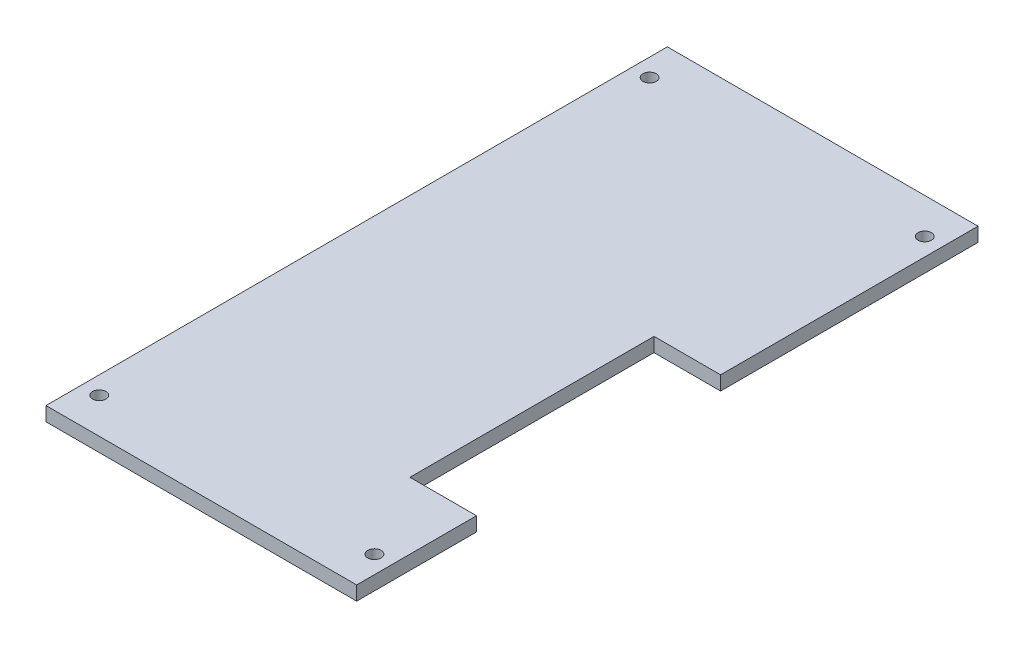
ISO-10303-21;
HEADER;
FILE_DESCRIPTION(('STEP AP214'),'2;1');
FILE_NAME('part.step','',(''),(''),'','','');
FILE_SCHEMA(('AUTOMOTIVE_DESIGN { 1 0 10303 214 1 1 1 1 }'));
ENDSEC;
DATA;
#1=APPLICATION_CONTEXT('core data for automotive mechanical design processes');
#2=APPLICATION_PROTOCOL_DEFINITION('international standard','automotive_design',2000,#1);
#3=PRODUCT_CONTEXT('',#1,'mechanical');
#4=PRODUCT('Part','Part','',(#3));
#5=PRODUCT_RELATED_PRODUCT_CATEGORY('part','',(#4));
#6=PRODUCT_DEFINITION_FORMATION('','',#4);
#7=PRODUCT_DEFINITION_CONTEXT('part definition',#1,'design');
#8=PRODUCT_DEFINITION('design','',#6,#7);
#9=PRODUCT_DEFINITION_SHAPE('','',#8);
#10=(LENGTH_UNIT() NAMED_UNIT(*) SI_UNIT(.MILLI.,.METRE.));
#11=(NAMED_UNIT(*) PLANE_ANGLE_UNIT() SI_UNIT($,.RADIAN.));
#12=(NAMED_UNIT(*) SI_UNIT($,.STERADIAN.) SOLID_ANGLE_UNIT());
#13=UNCERTAINTY_MEASURE_WITH_UNIT(LENGTH_MEASURE(1.E-05),#10,'distance_accuracy_value','');
#14=(GEOMETRIC_REPRESENTATION_CONTEXT(3) GLOBAL_UNCERTAINTY_ASSIGNED_CONTEXT((#13)) GLOBAL_UNIT_ASSIGNED_CONTEXT((#10,
#11,#12)) REPRESENTATION_CONTEXT('',''));
#15=CARTESIAN_POINT('',(0.,0.,0.));
#16=DIRECTION('',(0.,0.,1.));
#17=DIRECTION('',(1.,0.,0.));
#18=AXIS2_PLACEMENT_3D('',#15,#16,#17);
#19=CARTESIAN_POINT('',(0.,3.175,0.));
#20=DIRECTION('',(0.,1.,0.));
#21=DIRECTION('',(0.,0.,1.));
#22=AXIS2_PLACEMENT_3D('',#19,#20,#21);
#23=PLANE('',#22);
#24=CARTESIAN_POINT('',(-31.,3.175,-62.));
#25=DIRECTION('',(0.,1.,0.));
#26=DIRECTION('',(0.,0.,1.));
#27=AXIS2_PLACEMENT_3D('',#24,#25,#26);
#28=CIRCLE('',#27,1.5);
#29=CARTESIAN_POINT('',(-31.,3.175,-60.5));
#30=VERTEX_POINT('',#29);
#31=EDGE_CURVE('E190',#30,#30,#28,.T.);
#32=ORIENTED_EDGE('',*,*,#31,.F.);
#33=EDGE_LOOP('',(#32));
#34=FACE_BOUND('',#33,.T.);
#35=CARTESIAN_POINT('',(31.,3.175,62.));
#36=DIRECTION('',(0.,1.,0.));
#37=DIRECTION('',(0.,0.,1.));
#38=AXIS2_PLACEMENT_3D('',#35,#36,#37);
#39=CIRCLE('',#38,1.50000000000001);
#40=CARTESIAN_POINT('',(31.,3.175,63.5));
#41=VERTEX_POINT('',#40);
#42=EDGE_CURVE('E136',#41,#41,#39,.T.);
#43=ORIENTED_EDGE('',*,*,#42,.F.);
#44=EDGE_LOOP('',(#43));
#45=FACE_BOUND('',#44,.T.);
#46=DIRECTION('',(0.,0.,1.));
#47=VECTOR('',#46,1.);
#48=CARTESIAN_POINT('',(-35.,3.175,70.));
#49=LINE('',#48,#47);
#50=CARTESIAN_POINT('',(-35.,3.175,-70.));
#51=VERTEX_POINT('',#50);
#52=CARTESIAN_POINT('',(-35.,3.175,70.));
#53=VERTEX_POINT('',#52);
#54=EDGE_CURVE('E147',#51,#53,#49,.T.);
#55=ORIENTED_EDGE('',*,*,#54,.T.);
#56=DIRECTION('',(1.,0.,0.));
#57=VECTOR('',#56,1.);
#58=CARTESIAN_POINT('',(35.,3.175,70.));
#59=LINE('',#58,#57);
#60=CARTESIAN_POINT('',(35.,3.175,70.));
#61=VERTEX_POINT('',#60);
#62=EDGE_CURVE('E95',#53,#61,#59,.T.);
#63=ORIENTED_EDGE('',*,*,#62,.T.);
#64=DIRECTION('',(0.,0.,-1.));
#65=VECTOR('',#64,1.);
#66=CARTESIAN_POINT('',(35.,3.175,70.));
#67=LINE('',#66,#65);
#68=CARTESIAN_POINT('',(35.,3.175,43.));
#69=VERTEX_POINT('',#68);
#70=EDGE_CURVE('E162',#61,#69,#67,.T.);
#71=ORIENTED_EDGE('',*,*,#70,.T.);
#72=DIRECTION('',(-1.,0.,0.));
#73=VECTOR('',#72,1.);
#74=CARTESIAN_POINT('',(20.,3.175,43.));
#75=LINE('',#74,#73);
#76=CARTESIAN_POINT('',(20.,3.175,43.));
#77=VERTEX_POINT('',#76);
#78=EDGE_CURVE('E175',#69,#77,#75,.T.);
#79=ORIENTED_EDGE('',*,*,#78,.T.);
#80=DIRECTION('',(0.,0.,-1.));
#81=VECTOR('',#80,1.);
#82=CARTESIAN_POINT('',(20.,3.175,-11.999999982));
#83=LINE('',#82,#81);
#84=CARTESIAN_POINT('',(20.,3.175,-11.999999982));
#85=VERTEX_POINT('',#84);
#86=EDGE_CURVE('E114',#77,#85,#83,.T.);
#87=ORIENTED_EDGE('',*,*,#86,.T.);
#88=DIRECTION('',(1.,0.,0.));
#89=VECTOR('',#88,1.);
#90=CARTESIAN_POINT('',(35.,3.175,-11.999999982));
#91=LINE('',#90,#89);
#92=CARTESIAN_POINT('',(35.,3.175,-11.999999982));
#93=VERTEX_POINT('',#92);
#94=EDGE_CURVE('E108',#85,#93,#91,.T.);
#95=ORIENTED_EDGE('',*,*,#94,.T.);
#96=DIRECTION('',(0.,0.,-1.));
#97=VECTOR('',#96,1.);
#98=CARTESIAN_POINT('',(35.,3.175,-11.999999982));
#99=LINE('',#98,#97);
#100=CARTESIAN_POINT('',(35.,3.175,-70.));
#101=VERTEX_POINT('',#100);
#102=EDGE_CURVE('E112',#93,#101,#99,.T.);
#103=ORIENTED_EDGE('',*,*,#102,.T.);
#104=DIRECTION('',(-1.,0.,0.));
#105=VECTOR('',#104,1.);
#106=CARTESIAN_POINT('',(35.,3.175,-70.));
#107=LINE('',#106,#105);
#108=EDGE_CURVE('E52',#101,#51,#107,.T.);
#109=ORIENTED_EDGE('',*,*,#108,.T.);
#110=EDGE_LOOP('',(#55,#63,#71,#79,#87,#95,#103,#109));
#111=FACE_BOUND('',#110,.T.);
#112=CARTESIAN_POINT('',(-31.,3.175,62.));
#113=DIRECTION('',(0.,1.,0.));
#114=DIRECTION('',(0.,0.,-1.));
#115=AXIS2_PLACEMENT_3D('',#112,#113,#114);
#116=CIRCLE('',#115,1.50000000000001);
#117=CARTESIAN_POINT('',(-31.,3.175,60.5));
#118=VERTEX_POINT('',#117);
#119=EDGE_CURVE('E184',#118,#118,#116,.T.);
#120=ORIENTED_EDGE('',*,*,#119,.F.);
#121=EDGE_LOOP('',(#120));
#122=FACE_BOUND('',#121,.T.);
#123=CARTESIAN_POINT('',(31.,3.175,-62.));
#124=DIRECTION('',(0.,1.,0.));
#125=DIRECTION('',(0.,0.,-1.));
#126=AXIS2_PLACEMENT_3D('',#123,#124,#125);
#127=CIRCLE('',#126,1.50000000000001);
#128=CARTESIAN_POINT('',(31.,3.175,-63.5));
#129=VERTEX_POINT('',#128);
#130=EDGE_CURVE('E196',#129,#129,#127,.T.);
#131=ORIENTED_EDGE('',*,*,#130,.F.);
#132=EDGE_LOOP('',(#131));
#133=FACE_BOUND('',#132,.T.);
#134=ADVANCED_FACE('F35',(#34,#45,#111,#122,#133),#23,.T.);
#135=CARTESIAN_POINT('',(0.,0.,0.));
#136=DIRECTION('',(0.,1.,0.));
#137=DIRECTION('',(0.,0.,1.));
#138=AXIS2_PLACEMENT_3D('',#135,#136,#137);
#139=PLANE('',#138);
#140=CARTESIAN_POINT('',(-31.,0.,-62.));
#141=DIRECTION('',(0.,1.,0.));
#142=DIRECTION('',(0.,0.,1.));
#143=AXIS2_PLACEMENT_3D('',#140,#141,#142);
#144=CIRCLE('',#143,1.5);
#145=CARTESIAN_POINT('',(-31.,0.,-60.5));
#146=VERTEX_POINT('',#145);
#147=EDGE_CURVE('E193',#146,#146,#144,.T.);
#148=ORIENTED_EDGE('',*,*,#147,.T.);
#149=EDGE_LOOP('',(#148));
#150=FACE_BOUND('',#149,.T.);
#151=CARTESIAN_POINT('',(31.,0.,62.));
#152=DIRECTION('',(0.,1.,0.));
#153=DIRECTION('',(0.,0.,1.));
#154=AXIS2_PLACEMENT_3D('',#151,#152,#153);
#155=CIRCLE('',#154,1.50000000000001);
#156=CARTESIAN_POINT('',(31.,0.,63.5));
#157=VERTEX_POINT('',#156);
#158=EDGE_CURVE('E181',#157,#157,#155,.T.);
#159=ORIENTED_EDGE('',*,*,#158,.T.);
#160=EDGE_LOOP('',(#159));
#161=FACE_BOUND('',#160,.T.);
#162=DIRECTION('',(0.,0.,1.));
#163=VECTOR('',#162,1.);
#164=CARTESIAN_POINT('',(-35.,0.,70.));
#165=LINE('',#164,#163);
#166=CARTESIAN_POINT('',(-35.,0.,-70.));
#167=VERTEX_POINT('',#166);
#168=CARTESIAN_POINT('',(-35.,0.,70.));
#169=VERTEX_POINT('',#168);
#170=EDGE_CURVE('E132',#167,#169,#165,.T.);
#171=ORIENTED_EDGE('',*,*,#170,.F.);
#172=DIRECTION('',(-1.,0.,0.));
#173=VECTOR('',#172,1.);
#174=CARTESIAN_POINT('',(35.,0.,-70.));
#175=LINE('',#174,#173);
#176=CARTESIAN_POINT('',(35.,0.,-70.));
#177=VERTEX_POINT('',#176);
#178=EDGE_CURVE('E87',#177,#167,#175,.T.);
#179=ORIENTED_EDGE('',*,*,#178,.F.);
#180=DIRECTION('',(0.,0.,-1.));
#181=VECTOR('',#180,1.);
#182=CARTESIAN_POINT('',(35.,0.,-11.999999982));
#183=LINE('',#182,#181);
#184=CARTESIAN_POINT('',(35.,0.,-11.999999982));
#185=VERTEX_POINT('',#184);
#186=EDGE_CURVE('E81',#185,#177,#183,.T.);
#187=ORIENTED_EDGE('',*,*,#186,.F.);
#188=DIRECTION('',(1.,0.,0.));
#189=VECTOR('',#188,1.);
#190=CARTESIAN_POINT('',(35.,0.,-11.999999982));
#191=LINE('',#190,#189);
#192=CARTESIAN_POINT('',(20.,0.,-11.999999982));
#193=VERTEX_POINT('',#192);
#194=EDGE_CURVE('E122',#193,#185,#191,.T.);
#195=ORIENTED_EDGE('',*,*,#194,.F.);
#196=DIRECTION('',(0.,0.,-1.));
#197=VECTOR('',#196,1.);
#198=CARTESIAN_POINT('',(20.,0.,-11.999999982));
#199=LINE('',#198,#197);
#200=CARTESIAN_POINT('',(20.,0.,43.));
#201=VERTEX_POINT('',#200);
#202=EDGE_CURVE('E142',#201,#193,#199,.T.);
#203=ORIENTED_EDGE('',*,*,#202,.F.);
#204=DIRECTION('',(-1.,0.,0.));
#205=VECTOR('',#204,1.);
#206=CARTESIAN_POINT('',(20.,0.,43.));
#207=LINE('',#206,#205);
#208=CARTESIAN_POINT('',(35.,0.,43.));
#209=VERTEX_POINT('',#208);
#210=EDGE_CURVE('E140',#209,#201,#207,.T.);
#211=ORIENTED_EDGE('',*,*,#210,.F.);
#212=DIRECTION('',(0.,0.,-1.));
#213=VECTOR('',#212,1.);
#214=CARTESIAN_POINT('',(35.,0.,70.));
#215=LINE('',#214,#213);
#216=CARTESIAN_POINT('',(35.,0.,70.));
#217=VERTEX_POINT('',#216);
#218=EDGE_CURVE('E138',#217,#209,#215,.T.);
#219=ORIENTED_EDGE('',*,*,#218,.F.);
#220=DIRECTION('',(1.,0.,0.));
#221=VECTOR('',#220,1.);
#222=CARTESIAN_POINT('',(35.,0.,70.));
#223=LINE('',#222,#221);
#224=EDGE_CURVE('E135',#169,#217,#223,.T.);
#225=ORIENTED_EDGE('',*,*,#224,.F.);
#226=EDGE_LOOP('',(#171,#179,#187,#195,#203,#211,#219,#225));
#227=FACE_BOUND('',#226,.T.);
#228=CARTESIAN_POINT('',(-31.,0.,62.));
#229=DIRECTION('',(0.,1.,0.));
#230=DIRECTION('',(0.,0.,-1.));
#231=AXIS2_PLACEMENT_3D('',#228,#229,#230);
#232=CIRCLE('',#231,1.50000000000001);
#233=CARTESIAN_POINT('',(-31.,0.,60.5));
#234=VERTEX_POINT('',#233);
#235=EDGE_CURVE('E187',#234,#234,#232,.T.);
#236=ORIENTED_EDGE('',*,*,#235,.T.);
#237=EDGE_LOOP('',(#236));
#238=FACE_BOUND('',#237,.T.);
#239=CARTESIAN_POINT('',(31.,0.,-62.));
#240=DIRECTION('',(0.,1.,0.));
#241=DIRECTION('',(0.,0.,-1.));
#242=AXIS2_PLACEMENT_3D('',#239,#240,#241);
#243=CIRCLE('',#242,1.50000000000001);
#244=CARTESIAN_POINT('',(31.,0.,-63.5));
#245=VERTEX_POINT('',#244);
#246=EDGE_CURVE('E199',#245,#245,#243,.T.);
#247=ORIENTED_EDGE('',*,*,#246,.T.);
#248=EDGE_LOOP('',(#247));
#249=FACE_BOUND('',#248,.T.);
#250=ADVANCED_FACE('F166',(#150,#161,#227,#238,#249),#139,.F.);
#251=CARTESIAN_POINT('',(-35.,3.175,70.));
#252=DIRECTION('',(1.,0.,0.));
#253=DIRECTION('',(0.,0.,-1.));
#254=AXIS2_PLACEMENT_3D('',#251,#252,#253);
#255=PLANE('',#254);
#256=ORIENTED_EDGE('',*,*,#170,.T.);
#257=DIRECTION('',(0.,-1.,0.));
#258=VECTOR('',#257,1.);
#259=CARTESIAN_POINT('',(-35.,3.175,70.));
#260=LINE('',#259,#258);
#261=EDGE_CURVE('E11',#53,#169,#260,.T.);
#262=ORIENTED_EDGE('',*,*,#261,.F.);
#263=ORIENTED_EDGE('',*,*,#54,.F.);
#264=DIRECTION('',(0.,-1.,0.));
#265=VECTOR('',#264,1.);
#266=CARTESIAN_POINT('',(-35.,3.175,-70.));
#267=LINE('',#266,#265);
#268=EDGE_CURVE('E128',#51,#167,#267,.T.);
#269=ORIENTED_EDGE('',*,*,#268,.T.);
#270=EDGE_LOOP('',(#256,#262,#263,#269));
#271=FACE_BOUND('',#270,.T.);
#272=ADVANCED_FACE('F37',(#271),#255,.F.);
#273=CARTESIAN_POINT('',(35.,3.175,70.));
#274=DIRECTION('',(0.,0.,-1.));
#275=DIRECTION('',(-1.,0.,0.));
#276=AXIS2_PLACEMENT_3D('',#273,#274,#275);
#277=PLANE('',#276);
#278=ORIENTED_EDGE('',*,*,#224,.T.);
#279=DIRECTION('',(0.,-1.,0.));
#280=VECTOR('',#279,1.);
#281=CARTESIAN_POINT('',(35.,3.175,70.));
#282=LINE('',#281,#280);
#283=EDGE_CURVE('E44',#61,#217,#282,.T.);
#284=ORIENTED_EDGE('',*,*,#283,.F.);
#285=ORIENTED_EDGE('',*,*,#62,.F.);
#286=ORIENTED_EDGE('',*,*,#261,.T.);
#287=EDGE_LOOP('',(#278,#284,#285,#286));
#288=FACE_BOUND('',#287,.T.);
#289=ADVANCED_FACE('F234',(#288),#277,.F.);
#290=CARTESIAN_POINT('',(35.,3.175,70.));
#291=DIRECTION('',(-1.,0.,0.));
#292=DIRECTION('',(0.,0.,1.));
#293=AXIS2_PLACEMENT_3D('',#290,#291,#292);
#294=PLANE('',#293);
#295=ORIENTED_EDGE('',*,*,#218,.T.);
#296=DIRECTION('',(0.,-1.,0.));
#297=VECTOR('',#296,1.);
#298=CARTESIAN_POINT('',(35.,3.175,43.));
#299=LINE('',#298,#297);
#300=EDGE_CURVE('E154',#69,#209,#299,.T.);
#301=ORIENTED_EDGE('',*,*,#300,.F.);
#302=ORIENTED_EDGE('',*,*,#70,.F.);
#303=ORIENTED_EDGE('',*,*,#283,.T.);
#304=EDGE_LOOP('',(#295,#301,#302,#303));
#305=FACE_BOUND('',#304,.T.);
#306=ADVANCED_FACE('F160',(#305),#294,.F.);
#307=CARTESIAN_POINT('',(20.,3.175,43.));
#308=DIRECTION('',(0.,0.,1.));
#309=DIRECTION('',(1.,0.,0.));
#310=AXIS2_PLACEMENT_3D('',#307,#308,#309);
#311=PLANE('',#310);
#312=ORIENTED_EDGE('',*,*,#210,.T.);
#313=DIRECTION('',(0.,-1.,0.));
#314=VECTOR('',#313,1.);
#315=CARTESIAN_POINT('',(20.,3.175,43.));
#316=LINE('',#315,#314);
#317=EDGE_CURVE('E151',#77,#201,#316,.T.);
#318=ORIENTED_EDGE('',*,*,#317,.F.);
#319=ORIENTED_EDGE('',*,*,#78,.F.);
#320=ORIENTED_EDGE('',*,*,#300,.T.);
#321=EDGE_LOOP('',(#312,#318,#319,#320));
#322=FACE_BOUND('',#321,.T.);
#323=ADVANCED_FACE('F171',(#322),#311,.F.);
#324=CARTESIAN_POINT('',(20.,3.175,-11.999999982));
#325=DIRECTION('',(-1.,0.,0.));
#326=DIRECTION('',(0.,0.,1.));
#327=AXIS2_PLACEMENT_3D('',#324,#325,#326);
#328=PLANE('',#327);
#329=ORIENTED_EDGE('',*,*,#202,.T.);
#330=DIRECTION('',(0.,-1.,0.));
#331=VECTOR('',#330,1.);
#332=CARTESIAN_POINT('',(20.,3.175,-11.999999982));
#333=LINE('',#332,#331);
#334=EDGE_CURVE('E123',#85,#193,#333,.T.);
#335=ORIENTED_EDGE('',*,*,#334,.F.);
#336=ORIENTED_EDGE('',*,*,#86,.F.);
#337=ORIENTED_EDGE('',*,*,#317,.T.);
#338=EDGE_LOOP('',(#329,#335,#336,#337));
#339=FACE_BOUND('',#338,.T.);
#340=ADVANCED_FACE('F174',(#339),#328,.F.);
#341=CARTESIAN_POINT('',(35.,3.175,-11.999999982));
#342=DIRECTION('',(0.,0.,-1.));
#343=DIRECTION('',(-1.,0.,0.));
#344=AXIS2_PLACEMENT_3D('',#341,#342,#343);
#345=PLANE('',#344);
#346=ORIENTED_EDGE('',*,*,#194,.T.);
#347=DIRECTION('',(0.,-1.,0.));
#348=VECTOR('',#347,1.);
#349=CARTESIAN_POINT('',(35.,3.175,-11.999999982));
#350=LINE('',#349,#348);
#351=EDGE_CURVE('E119',#93,#185,#350,.T.);
#352=ORIENTED_EDGE('',*,*,#351,.F.);
#353=ORIENTED_EDGE('',*,*,#94,.F.);
#354=ORIENTED_EDGE('',*,*,#334,.T.);
#355=EDGE_LOOP('',(#346,#352,#353,#354));
#356=FACE_BOUND('',#355,.T.);
#357=ADVANCED_FACE('F120',(#356),#345,.F.);
#358=CARTESIAN_POINT('',(35.,3.175,-11.999999982));
#359=DIRECTION('',(-1.,0.,0.));
#360=DIRECTION('',(0.,0.,1.));
#361=AXIS2_PLACEMENT_3D('',#358,#359,#360);
#362=PLANE('',#361);
#363=ORIENTED_EDGE('',*,*,#186,.T.);
#364=DIRECTION('',(0.,-1.,0.));
#365=VECTOR('',#364,1.);
#366=CARTESIAN_POINT('',(35.,3.175,-70.));
#367=LINE('',#366,#365);
#368=EDGE_CURVE('E124',#101,#177,#367,.T.);
#369=ORIENTED_EDGE('',*,*,#368,.F.);
#370=ORIENTED_EDGE('',*,*,#102,.F.);
#371=ORIENTED_EDGE('',*,*,#351,.T.);
#372=EDGE_LOOP('',(#363,#369,#370,#371));
#373=FACE_BOUND('',#372,.T.);
#374=ADVANCED_FACE('F126',(#373),#362,.F.);
#375=CARTESIAN_POINT('',(35.,3.175,-70.));
#376=DIRECTION('',(0.,0.,1.));
#377=DIRECTION('',(1.,0.,0.));
#378=AXIS2_PLACEMENT_3D('',#375,#376,#377);
#379=PLANE('',#378);
#380=ORIENTED_EDGE('',*,*,#178,.T.);
#381=ORIENTED_EDGE('',*,*,#268,.F.);
#382=ORIENTED_EDGE('',*,*,#108,.F.);
#383=ORIENTED_EDGE('',*,*,#368,.T.);
#384=EDGE_LOOP('',(#380,#381,#382,#383));
#385=FACE_BOUND('',#384,.T.);
#386=ADVANCED_FACE('F222',(#385),#379,.F.);
#387=CARTESIAN_POINT('',(31.,3.175,62.));
#388=DIRECTION('',(0.,-1.,0.));
#389=DIRECTION('',(0.,0.,-1.));
#390=AXIS2_PLACEMENT_3D('',#387,#388,#389);
#391=CYLINDRICAL_SURFACE('',#390,1.50000000000001);
#392=ORIENTED_EDGE('',*,*,#42,.T.);
#393=EDGE_LOOP('',(#392));
#394=FACE_BOUND('',#393,.T.);
#395=ORIENTED_EDGE('',*,*,#158,.F.);
#396=EDGE_LOOP('',(#395));
#397=FACE_BOUND('',#396,.T.);
#398=ADVANCED_FACE('F219',(#394,#397),#391,.F.);
#399=CARTESIAN_POINT('',(-31.,3.175,62.));
#400=DIRECTION('',(0.,-1.,0.));
#401=DIRECTION('',(0.,0.,-1.));
#402=AXIS2_PLACEMENT_3D('',#399,#400,#401);
#403=CYLINDRICAL_SURFACE('',#402,1.50000000000001);
#404=ORIENTED_EDGE('',*,*,#119,.T.);
#405=EDGE_LOOP('',(#404));
#406=FACE_BOUND('',#405,.T.);
#407=ORIENTED_EDGE('',*,*,#235,.F.);
#408=EDGE_LOOP('',(#407));
#409=FACE_BOUND('',#408,.T.);
#410=ADVANCED_FACE('F298',(#406,#409),#403,.F.);
#411=CARTESIAN_POINT('',(-31.,3.175,-62.));
#412=DIRECTION('',(0.,-1.,0.));
#413=DIRECTION('',(0.,0.,-1.));
#414=AXIS2_PLACEMENT_3D('',#411,#412,#413);
#415=CYLINDRICAL_SURFACE('',#414,1.5);
#416=ORIENTED_EDGE('',*,*,#31,.T.);
#417=EDGE_LOOP('',(#416));
#418=FACE_BOUND('',#417,.T.);
#419=ORIENTED_EDGE('',*,*,#147,.F.);
#420=EDGE_LOOP('',(#419));
#421=FACE_BOUND('',#420,.T.);
#422=ADVANCED_FACE('F306',(#418,#421),#415,.F.);
#423=CARTESIAN_POINT('',(31.,3.175,-62.));
#424=DIRECTION('',(0.,-1.,0.));
#425=DIRECTION('',(0.,0.,-1.));
#426=AXIS2_PLACEMENT_3D('',#423,#424,#425);
#427=CYLINDRICAL_SURFACE('',#426,1.50000000000001);
#428=ORIENTED_EDGE('',*,*,#130,.T.);
#429=EDGE_LOOP('',(#428));
#430=FACE_BOUND('',#429,.T.);
#431=ORIENTED_EDGE('',*,*,#246,.F.);
#432=EDGE_LOOP('',(#431));
#433=FACE_BOUND('',#432,.T.);
#434=ADVANCED_FACE('F205',(#430,#433),#427,.F.);
#435=CLOSED_SHELL('',(#134,#250,#272,#289,#306,#323,#340,#357,#374,#386,#398,#410,#422,#434));
#436=MANIFOLD_SOLID_BREP('B2',#435);
#437=ADVANCED_BREP_SHAPE_REPRESENTATION('',(#18,#436),#14);
#438=SHAPE_DEFINITION_REPRESENTATION(#9,#437);
ENDSEC;
END-ISO-10303-21;
